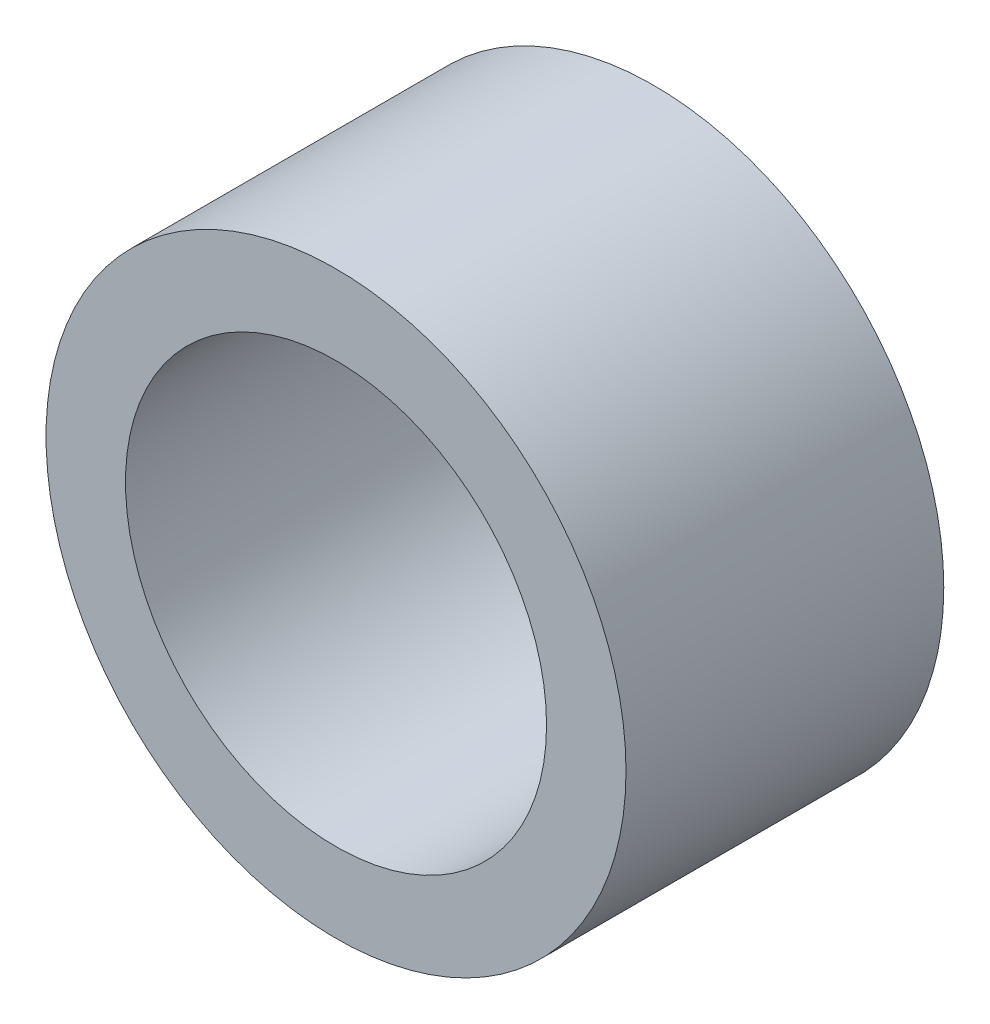
ISO-10303-21;
HEADER;
FILE_DESCRIPTION(('STEP AP214'),'2;1');
FILE_NAME('part.step','',(''),(''),'','','');
FILE_SCHEMA(('AUTOMOTIVE_DESIGN { 1 0 10303 214 1 1 1 1 }'));
ENDSEC;
DATA;
#1=APPLICATION_CONTEXT('core data for automotive mechanical design processes');
#2=APPLICATION_PROTOCOL_DEFINITION('international standard','automotive_design',2000,#1);
#3=PRODUCT_CONTEXT('',#1,'mechanical');
#4=PRODUCT('Part','Part','',(#3));
#5=PRODUCT_RELATED_PRODUCT_CATEGORY('part','',(#4));
#6=PRODUCT_DEFINITION_FORMATION('','',#4);
#7=PRODUCT_DEFINITION_CONTEXT('part definition',#1,'design');
#8=PRODUCT_DEFINITION('design','',#6,#7);
#9=PRODUCT_DEFINITION_SHAPE('','',#8);
#10=(LENGTH_UNIT() NAMED_UNIT(*) SI_UNIT(.MILLI.,.METRE.));
#11=(NAMED_UNIT(*) PLANE_ANGLE_UNIT() SI_UNIT($,.RADIAN.));
#12=(NAMED_UNIT(*) SI_UNIT($,.STERADIAN.) SOLID_ANGLE_UNIT());
#13=UNCERTAINTY_MEASURE_WITH_UNIT(LENGTH_MEASURE(1.E-05),#10,'distance_accuracy_value','');
#14=(GEOMETRIC_REPRESENTATION_CONTEXT(3) GLOBAL_UNCERTAINTY_ASSIGNED_CONTEXT((#13)) GLOBAL_UNIT_ASSIGNED_CONTEXT((#10,
#11,#12)) REPRESENTATION_CONTEXT('',''));
#15=CARTESIAN_POINT('',(0.,0.,0.));
#16=DIRECTION('',(0.,0.,1.));
#17=DIRECTION('',(1.,0.,0.));
#18=AXIS2_PLACEMENT_3D('',#15,#16,#17);
#19=CARTESIAN_POINT('',(0.,0.,8.));
#20=DIRECTION('',(0.,0.,1.));
#21=DIRECTION('',(1.,0.,0.));
#22=AXIS2_PLACEMENT_3D('',#19,#20,#21);
#23=PLANE('',#22);
#24=CARTESIAN_POINT('',(0.,0.,8.));
#25=DIRECTION('',(0.,0.,1.));
#26=DIRECTION('',(1.,0.,0.));
#27=AXIS2_PLACEMENT_3D('',#24,#25,#26);
#28=CIRCLE('',#27,7.3);
#29=CARTESIAN_POINT('',(7.3,0.,8.));
#30=VERTEX_POINT('',#29);
#31=EDGE_CURVE('E10',#30,#30,#28,.T.);
#32=ORIENTED_EDGE('',*,*,#31,.T.);
#33=EDGE_LOOP('',(#32));
#34=FACE_BOUND('',#33,.T.);
#35=CARTESIAN_POINT('',(0.,0.,8.));
#36=DIRECTION('',(0.,0.,1.));
#37=DIRECTION('',(1.,0.,0.));
#38=AXIS2_PLACEMENT_3D('',#35,#36,#37);
#39=CIRCLE('',#38,5.3);
#40=CARTESIAN_POINT('',(5.3,0.,8.));
#41=VERTEX_POINT('',#40);
#42=EDGE_CURVE('E50',#41,#41,#39,.T.);
#43=ORIENTED_EDGE('',*,*,#42,.F.);
#44=EDGE_LOOP('',(#43));
#45=FACE_BOUND('',#44,.T.);
#46=ADVANCED_FACE('F37',(#34,#45),#23,.T.);
#47=CARTESIAN_POINT('',(0.,0.,0.));
#48=DIRECTION('',(0.,0.,1.));
#49=DIRECTION('',(1.,0.,0.));
#50=AXIS2_PLACEMENT_3D('',#47,#48,#49);
#51=PLANE('',#50);
#52=CARTESIAN_POINT('',(0.,0.,0.));
#53=DIRECTION('',(0.,0.,1.));
#54=DIRECTION('',(1.,0.,0.));
#55=AXIS2_PLACEMENT_3D('',#52,#53,#54);
#56=CIRCLE('',#55,7.3);
#57=CARTESIAN_POINT('',(7.3,0.,0.));
#58=VERTEX_POINT('',#57);
#59=EDGE_CURVE('E41',#58,#58,#56,.T.);
#60=ORIENTED_EDGE('',*,*,#59,.F.);
#61=EDGE_LOOP('',(#60));
#62=FACE_BOUND('',#61,.T.);
#63=CARTESIAN_POINT('',(0.,0.,0.));
#64=DIRECTION('',(0.,0.,1.));
#65=DIRECTION('',(1.,0.,0.));
#66=AXIS2_PLACEMENT_3D('',#63,#64,#65);
#67=CIRCLE('',#66,5.3);
#68=CARTESIAN_POINT('',(5.3,0.,0.));
#69=VERTEX_POINT('',#68);
#70=EDGE_CURVE('E52',#69,#69,#67,.T.);
#71=ORIENTED_EDGE('',*,*,#70,.T.);
#72=EDGE_LOOP('',(#71));
#73=FACE_BOUND('',#72,.T.);
#74=ADVANCED_FACE('F64',(#62,#73),#51,.F.);
#75=CARTESIAN_POINT('',(0.,0.,8.));
#76=DIRECTION('',(0.,0.,-1.));
#77=DIRECTION('',(-1.,0.,0.));
#78=AXIS2_PLACEMENT_3D('',#75,#76,#77);
#79=CYLINDRICAL_SURFACE('',#78,7.3);
#80=ORIENTED_EDGE('',*,*,#31,.F.);
#81=EDGE_LOOP('',(#80));
#82=FACE_BOUND('',#81,.T.);
#83=ORIENTED_EDGE('',*,*,#59,.T.);
#84=EDGE_LOOP('',(#83));
#85=FACE_BOUND('',#84,.T.);
#86=ADVANCED_FACE('F39',(#82,#85),#79,.T.);
#87=CARTESIAN_POINT('',(0.,0.,8.));
#88=DIRECTION('',(0.,0.,-1.));
#89=DIRECTION('',(-1.,0.,0.));
#90=AXIS2_PLACEMENT_3D('',#87,#88,#89);
#91=CYLINDRICAL_SURFACE('',#90,5.3);
#92=ORIENTED_EDGE('',*,*,#42,.T.);
#93=EDGE_LOOP('',(#92));
#94=FACE_BOUND('',#93,.T.);
#95=ORIENTED_EDGE('',*,*,#70,.F.);
#96=EDGE_LOOP('',(#95));
#97=FACE_BOUND('',#96,.T.);
#98=ADVANCED_FACE('F60',(#94,#97),#91,.F.);
#99=CLOSED_SHELL('',(#46,#74,#86,#98));
#100=MANIFOLD_SOLID_BREP('B2',#99);
#101=ADVANCED_BREP_SHAPE_REPRESENTATION('',(#18,#100),#14);
#102=SHAPE_DEFINITION_REPRESENTATION(#9,#101);
ENDSEC;
END-ISO-10303-21;
